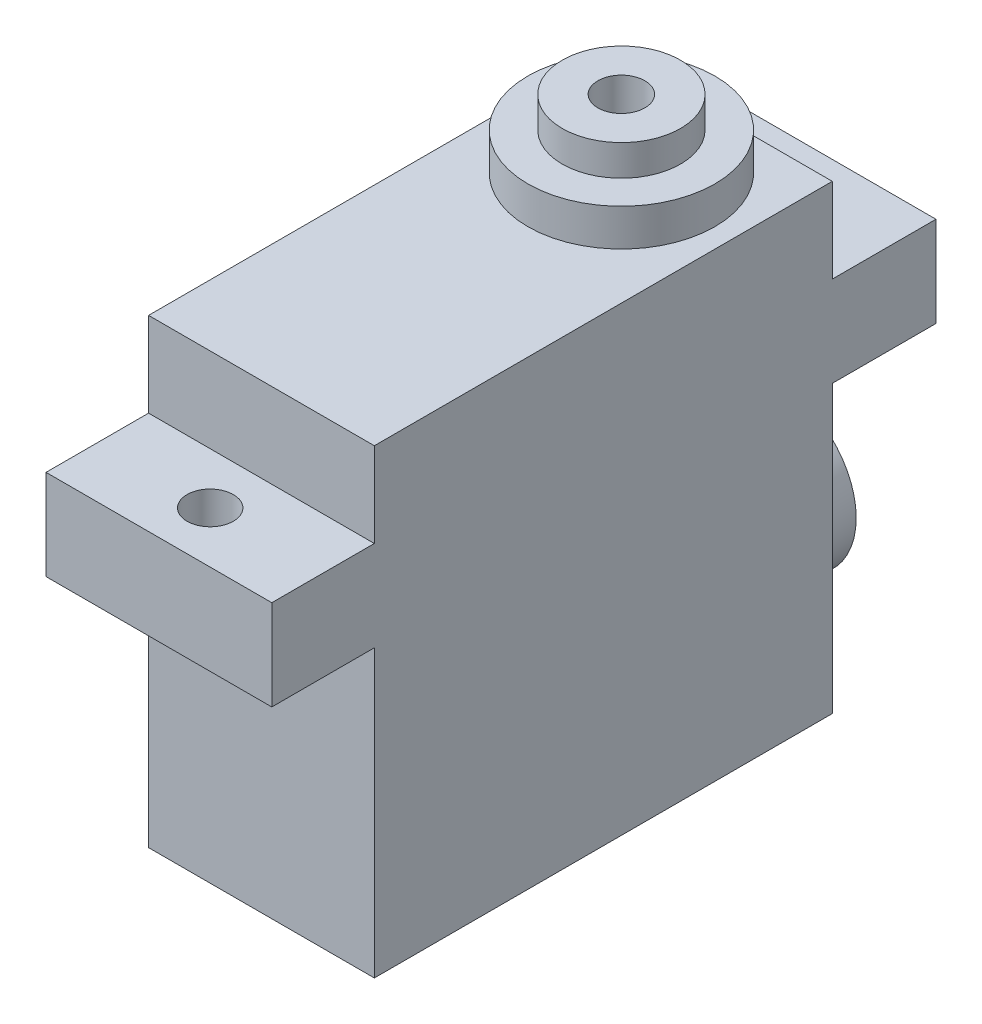
ISO-10303-21;
HEADER;
FILE_DESCRIPTION(('STEP AP214'),'2;1');
FILE_NAME('part.step','',(''),(''),'','','');
FILE_SCHEMA(('AUTOMOTIVE_DESIGN { 1 0 10303 214 1 1 1 1 }'));
ENDSEC;
DATA;
#1=APPLICATION_CONTEXT('core data for automotive mechanical design processes');
#2=APPLICATION_PROTOCOL_DEFINITION('international standard','automotive_design',2000,#1);
#3=PRODUCT_CONTEXT('',#1,'mechanical');
#4=PRODUCT('Part','Part','',(#3));
#5=PRODUCT_RELATED_PRODUCT_CATEGORY('part','',(#4));
#6=PRODUCT_DEFINITION_FORMATION('','',#4);
#7=PRODUCT_DEFINITION_CONTEXT('part definition',#1,'design');
#8=PRODUCT_DEFINITION('design','',#6,#7);
#9=PRODUCT_DEFINITION_SHAPE('','',#8);
#10=(LENGTH_UNIT() NAMED_UNIT(*) SI_UNIT(.MILLI.,.METRE.));
#11=(NAMED_UNIT(*) PLANE_ANGLE_UNIT() SI_UNIT($,.RADIAN.));
#12=(NAMED_UNIT(*) SI_UNIT($,.STERADIAN.) SOLID_ANGLE_UNIT());
#13=UNCERTAINTY_MEASURE_WITH_UNIT(LENGTH_MEASURE(1.E-05),#10,'distance_accuracy_value','');
#14=(GEOMETRIC_REPRESENTATION_CONTEXT(3) GLOBAL_UNCERTAINTY_ASSIGNED_CONTEXT((#13)) GLOBAL_UNIT_ASSIGNED_CONTEXT((#10,
#11,#12)) REPRESENTATION_CONTEXT('',''));
#15=CARTESIAN_POINT('',(0.,0.,0.));
#16=DIRECTION('',(0.,0.,1.));
#17=DIRECTION('',(1.,0.,0.));
#18=AXIS2_PLACEMENT_3D('',#15,#16,#17);
#19=CARTESIAN_POINT('',(0.,31.115,0.));
#20=DIRECTION('',(0.,0.,-1.));
#21=DIRECTION('',(-1.,0.,0.));
#22=AXIS2_PLACEMENT_3D('',#19,#20,#21);
#23=PLANE('',#22);
#24=DIRECTION('',(0.,-1.,0.));
#25=VECTOR('',#24,1.);
#26=CARTESIAN_POINT('',(0.,31.115,0.));
#27=LINE('',#26,#25);
#28=CARTESIAN_POINT('',(0.,31.115,0.));
#29=VERTEX_POINT('',#28);
#30=CARTESIAN_POINT('',(0.,25.4,0.));
#31=VERTEX_POINT('',#30);
#32=EDGE_CURVE('E244',#29,#31,#27,.T.);
#33=ORIENTED_EDGE('',*,*,#32,.T.);
#34=DIRECTION('',(1.,0.,0.));
#35=VECTOR('',#34,1.);
#36=CARTESIAN_POINT('',(0.,25.4,0.));
#37=LINE('',#36,#35);
#38=CARTESIAN_POINT('',(15.2399999999999,25.4,0.));
#39=VERTEX_POINT('',#38);
#40=EDGE_CURVE('E197',#31,#39,#37,.T.);
#41=ORIENTED_EDGE('',*,*,#40,.T.);
#42=DIRECTION('',(0.,-1.,0.));
#43=VECTOR('',#42,1.);
#44=CARTESIAN_POINT('',(15.2399999999999,31.115,0.));
#45=LINE('',#44,#43);
#46=CARTESIAN_POINT('',(15.2399999999999,31.115,0.));
#47=VERTEX_POINT('',#46);
#48=EDGE_CURVE('E240',#47,#39,#45,.T.);
#49=ORIENTED_EDGE('',*,*,#48,.F.);
#50=DIRECTION('',(1.,0.,0.));
#51=VECTOR('',#50,1.);
#52=CARTESIAN_POINT('',(0.,31.115,0.));
#53=LINE('',#52,#51);
#54=EDGE_CURVE('E206',#29,#47,#53,.T.);
#55=ORIENTED_EDGE('',*,*,#54,.F.);
#56=EDGE_LOOP('',(#33,#41,#49,#55));
#57=FACE_BOUND('',#56,.T.);
#58=ADVANCED_FACE('F39',(#57),#23,.F.);
#59=CARTESIAN_POINT('',(0.,31.115,-30.9117999999999));
#60=DIRECTION('',(0.,0.,1.));
#61=DIRECTION('',(1.,0.,0.));
#62=AXIS2_PLACEMENT_3D('',#59,#60,#61);
#63=PLANE('',#62);
#64=DIRECTION('',(0.,-1.,0.));
#65=VECTOR('',#64,1.);
#66=CARTESIAN_POINT('',(15.2399999999999,31.115,-30.9118));
#67=LINE('',#66,#65);
#68=CARTESIAN_POINT('',(15.2399999999999,31.115,-30.9118));
#69=VERTEX_POINT('',#68);
#70=CARTESIAN_POINT('',(15.2399999999999,25.4,-30.9118));
#71=VERTEX_POINT('',#70);
#72=EDGE_CURVE('E235',#69,#71,#67,.T.);
#73=ORIENTED_EDGE('',*,*,#72,.T.);
#74=DIRECTION('',(-1.,0.,0.));
#75=VECTOR('',#74,1.);
#76=CARTESIAN_POINT('',(0.,25.4,-30.9117999999999));
#77=LINE('',#76,#75);
#78=CARTESIAN_POINT('',(0.,25.4,-30.9118));
#79=VERTEX_POINT('',#78);
#80=EDGE_CURVE('E251',#71,#79,#77,.T.);
#81=ORIENTED_EDGE('',*,*,#80,.T.);
#82=DIRECTION('',(0.,-1.,0.));
#83=VECTOR('',#82,1.);
#84=CARTESIAN_POINT('',(0.,31.115,-30.9117999999999));
#85=LINE('',#84,#83);
#86=CARTESIAN_POINT('',(0.,31.115,-30.9117999999999));
#87=VERTEX_POINT('',#86);
#88=EDGE_CURVE('E230',#87,#79,#85,.T.);
#89=ORIENTED_EDGE('',*,*,#88,.F.);
#90=DIRECTION('',(-1.,0.,0.));
#91=VECTOR('',#90,1.);
#92=CARTESIAN_POINT('',(0.,31.115,-30.9117999999999));
#93=LINE('',#92,#91);
#94=EDGE_CURVE('E213',#69,#87,#93,.T.);
#95=ORIENTED_EDGE('',*,*,#94,.F.);
#96=EDGE_LOOP('',(#73,#81,#89,#95));
#97=FACE_BOUND('',#96,.T.);
#98=ADVANCED_FACE('F283',(#97),#63,.F.);
#99=CARTESIAN_POINT('',(0.,31.115,0.));
#100=DIRECTION('',(1.,0.,0.));
#101=DIRECTION('',(0.,0.,-1.));
#102=AXIS2_PLACEMENT_3D('',#99,#100,#101);
#103=PLANE('',#102);
#104=CARTESIAN_POINT('',(0.,19.304,0.));
#105=VERTEX_POINT('',#104);
#106=CARTESIAN_POINT('',(0.,0.,0.));
#107=VERTEX_POINT('',#106);
#108=EDGE_CURVE('E134',#105,#107,#27,.T.);
#109=ORIENTED_EDGE('',*,*,#108,.F.);
#110=DIRECTION('',(0.,0.,1.));
#111=VECTOR('',#110,1.);
#112=CARTESIAN_POINT('',(0.,19.304,-37.9095));
#113=LINE('',#112,#111);
#114=CARTESIAN_POINT('',(0.,19.304,6.9215));
#115=VERTEX_POINT('',#114);
#116=EDGE_CURVE('E56',#105,#115,#113,.T.);
#117=ORIENTED_EDGE('',*,*,#116,.T.);
#118=DIRECTION('',(0.,-1.,0.));
#119=VECTOR('',#118,1.);
#120=CARTESIAN_POINT('',(0.,25.4,6.9215));
#121=LINE('',#120,#119);
#122=CARTESIAN_POINT('',(0.,25.4,6.9215));
#123=VERTEX_POINT('',#122);
#124=EDGE_CURVE('E132',#123,#115,#121,.T.);
#125=ORIENTED_EDGE('',*,*,#124,.F.);
#126=DIRECTION('',(0.,0.,1.));
#127=VECTOR('',#126,1.);
#128=CARTESIAN_POINT('',(0.,25.4,-37.9095));
#129=LINE('',#128,#127);
#130=EDGE_CURVE('E185',#31,#123,#129,.T.);
#131=ORIENTED_EDGE('',*,*,#130,.F.);
#132=ORIENTED_EDGE('',*,*,#32,.F.);
#133=DIRECTION('',(0.,0.,1.));
#134=VECTOR('',#133,1.);
#135=CARTESIAN_POINT('',(0.,31.115,0.));
#136=LINE('',#135,#134);
#137=EDGE_CURVE('E202',#87,#29,#136,.T.);
#138=ORIENTED_EDGE('',*,*,#137,.F.);
#139=ORIENTED_EDGE('',*,*,#88,.T.);
#140=CARTESIAN_POINT('',(0.,25.4,-37.9095));
#141=VERTEX_POINT('',#140);
#142=EDGE_CURVE('E181',#141,#79,#129,.T.);
#143=ORIENTED_EDGE('',*,*,#142,.F.);
#144=DIRECTION('',(0.,-1.,0.));
#145=VECTOR('',#144,1.);
#146=CARTESIAN_POINT('',(0.,25.4,-37.9095));
#147=LINE('',#146,#145);
#148=CARTESIAN_POINT('',(0.,19.304,-37.9095));
#149=VERTEX_POINT('',#148);
#150=EDGE_CURVE('E167',#141,#149,#147,.T.);
#151=ORIENTED_EDGE('',*,*,#150,.T.);
#152=CARTESIAN_POINT('',(0.,19.304,-30.9118));
#153=VERTEX_POINT('',#152);
#154=EDGE_CURVE('E136',#149,#153,#113,.T.);
#155=ORIENTED_EDGE('',*,*,#154,.T.);
#156=CARTESIAN_POINT('',(0.,0.,-30.9117999999999));
#157=VERTEX_POINT('',#156);
#158=EDGE_CURVE('E216',#153,#157,#85,.T.);
#159=ORIENTED_EDGE('',*,*,#158,.T.);
#160=DIRECTION('',(0.,0.,1.));
#161=VECTOR('',#160,1.);
#162=CARTESIAN_POINT('',(0.,0.,0.));
#163=LINE('',#162,#161);
#164=EDGE_CURVE('E201',#157,#107,#163,.T.);
#165=ORIENTED_EDGE('',*,*,#164,.T.);
#166=EDGE_LOOP('',(#109,#117,#125,#131,#132,#138,#139,#143,#151,#155,#159,#165));
#167=FACE_BOUND('',#166,.T.);
#168=ADVANCED_FACE('F41',(#167),#103,.F.);
#169=CARTESIAN_POINT('',(15.2399999999999,19.304,0.));
#170=VERTEX_POINT('',#169);
#171=CARTESIAN_POINT('',(15.2399999999999,0.,0.));
#172=VERTEX_POINT('',#171);
#173=EDGE_CURVE('E239',#170,#172,#45,.T.);
#174=ORIENTED_EDGE('',*,*,#173,.F.);
#175=DIRECTION('',(-1.,0.,0.));
#176=VECTOR('',#175,1.);
#177=CARTESIAN_POINT('',(0.,19.304,0.));
#178=LINE('',#177,#176);
#179=EDGE_CURVE('E184',#170,#105,#178,.T.);
#180=ORIENTED_EDGE('',*,*,#179,.T.);
#181=ORIENTED_EDGE('',*,*,#108,.T.);
#182=DIRECTION('',(1.,0.,0.));
#183=VECTOR('',#182,1.);
#184=CARTESIAN_POINT('',(0.,0.,0.));
#185=LINE('',#184,#183);
#186=EDGE_CURVE('E219',#107,#172,#185,.T.);
#187=ORIENTED_EDGE('',*,*,#186,.T.);
#188=EDGE_LOOP('',(#174,#180,#181,#187));
#189=FACE_BOUND('',#188,.T.);
#190=ADVANCED_FACE('F317',(#189),#23,.F.);
#191=CARTESIAN_POINT('',(15.2399999999999,31.115,0.));
#192=DIRECTION('',(-1.,0.,0.));
#193=DIRECTION('',(0.,0.,1.));
#194=AXIS2_PLACEMENT_3D('',#191,#192,#193);
#195=PLANE('',#194);
#196=CARTESIAN_POINT('',(15.2399999999999,19.304,-30.9118));
#197=VERTEX_POINT('',#196);
#198=CARTESIAN_POINT('',(15.2399999999999,0.,-30.9118));
#199=VERTEX_POINT('',#198);
#200=EDGE_CURVE('E234',#197,#199,#67,.T.);
#201=ORIENTED_EDGE('',*,*,#200,.F.);
#202=DIRECTION('',(0.,0.,1.));
#203=VECTOR('',#202,1.);
#204=CARTESIAN_POINT('',(15.2399999999999,19.304,-37.9095));
#205=LINE('',#204,#203);
#206=CARTESIAN_POINT('',(15.2399999999999,19.304,-37.9095));
#207=VERTEX_POINT('',#206);
#208=EDGE_CURVE('E64',#207,#197,#205,.T.);
#209=ORIENTED_EDGE('',*,*,#208,.F.);
#210=DIRECTION('',(0.,1.,0.));
#211=VECTOR('',#210,1.);
#212=CARTESIAN_POINT('',(15.2399999999999,25.4,-37.9095));
#213=LINE('',#212,#211);
#214=CARTESIAN_POINT('',(15.2399999999999,25.4,-37.9095));
#215=VERTEX_POINT('',#214);
#216=EDGE_CURVE('E174',#207,#215,#213,.T.);
#217=ORIENTED_EDGE('',*,*,#216,.T.);
#218=DIRECTION('',(0.,0.,1.));
#219=VECTOR('',#218,1.);
#220=CARTESIAN_POINT('',(15.2399999999999,25.4,-37.9095));
#221=LINE('',#220,#219);
#222=EDGE_CURVE('E186',#215,#71,#221,.T.);
#223=ORIENTED_EDGE('',*,*,#222,.T.);
#224=ORIENTED_EDGE('',*,*,#72,.F.);
#225=DIRECTION('',(0.,0.,-1.));
#226=VECTOR('',#225,1.);
#227=CARTESIAN_POINT('',(15.2399999999999,31.115,0.));
#228=LINE('',#227,#226);
#229=EDGE_CURVE('E210',#47,#69,#228,.T.);
#230=ORIENTED_EDGE('',*,*,#229,.F.);
#231=ORIENTED_EDGE('',*,*,#48,.T.);
#232=CARTESIAN_POINT('',(15.2399999999999,25.4,6.9215));
#233=VERTEX_POINT('',#232);
#234=EDGE_CURVE('E190',#39,#233,#221,.T.);
#235=ORIENTED_EDGE('',*,*,#234,.T.);
#236=DIRECTION('',(0.,1.,0.));
#237=VECTOR('',#236,1.);
#238=CARTESIAN_POINT('',(15.2399999999999,25.4,6.9215));
#239=LINE('',#238,#237);
#240=CARTESIAN_POINT('',(15.2399999999999,19.304,6.9215));
#241=VERTEX_POINT('',#240);
#242=EDGE_CURVE('E148',#241,#233,#239,.T.);
#243=ORIENTED_EDGE('',*,*,#242,.F.);
#244=EDGE_CURVE('E143',#170,#241,#205,.T.);
#245=ORIENTED_EDGE('',*,*,#244,.F.);
#246=ORIENTED_EDGE('',*,*,#173,.T.);
#247=DIRECTION('',(0.,0.,-1.));
#248=VECTOR('',#247,1.);
#249=CARTESIAN_POINT('',(15.2399999999999,0.,0.));
#250=LINE('',#249,#248);
#251=EDGE_CURVE('E223',#172,#199,#250,.T.);
#252=ORIENTED_EDGE('',*,*,#251,.T.);
#253=EDGE_LOOP('',(#201,#209,#217,#223,#224,#230,#231,#235,#243,#245,#246,#252));
#254=FACE_BOUND('',#253,.T.);
#255=ADVANCED_FACE('F281',(#254),#195,.F.);
#256=CARTESIAN_POINT('',(7.61999999999996,8.2804,-30.9118));
#257=DIRECTION('',(0.,0.,1.));
#258=DIRECTION('',(1.,0.,0.));
#259=AXIS2_PLACEMENT_3D('',#256,#257,#258);
#260=CIRCLE('',#259,5.2705);
#261=CARTESIAN_POINT('',(12.8905,8.2804,-30.9118));
#262=VERTEX_POINT('',#261);
#263=EDGE_CURVE('E254',#262,#262,#260,.F.);
#264=ORIENTED_EDGE('',*,*,#263,.F.);
#265=EDGE_LOOP('',(#264));
#266=FACE_BOUND('',#265,.T.);
#267=ORIENTED_EDGE('',*,*,#158,.F.);
#268=DIRECTION('',(1.,0.,0.));
#269=VECTOR('',#268,1.);
#270=CARTESIAN_POINT('',(0.,19.304,-30.9117999999999));
#271=LINE('',#270,#269);
#272=EDGE_CURVE('E248',#153,#197,#271,.T.);
#273=ORIENTED_EDGE('',*,*,#272,.T.);
#274=ORIENTED_EDGE('',*,*,#200,.T.);
#275=DIRECTION('',(-1.,0.,0.));
#276=VECTOR('',#275,1.);
#277=CARTESIAN_POINT('',(0.,0.,-30.9117999999999));
#278=LINE('',#277,#276);
#279=EDGE_CURVE('E207',#199,#157,#278,.T.);
#280=ORIENTED_EDGE('',*,*,#279,.T.);
#281=EDGE_LOOP('',(#267,#273,#274,#280));
#282=FACE_BOUND('',#281,.T.);
#283=ADVANCED_FACE('F269',(#266,#282),#63,.F.);
#284=CARTESIAN_POINT('',(0.,31.115,0.));
#285=DIRECTION('',(0.,-1.,0.));
#286=DIRECTION('',(0.,0.,-1.));
#287=AXIS2_PLACEMENT_3D('',#284,#285,#286);
#288=PLANE('',#287);
#289=CARTESIAN_POINT('',(7.61999999999996,31.115,-24.2951));
#290=DIRECTION('',(0.,-1.,0.));
#291=DIRECTION('',(0.,0.,-1.));
#292=AXIS2_PLACEMENT_3D('',#289,#290,#291);
#293=CIRCLE('',#292,6.3119);
#294=CARTESIAN_POINT('',(7.61999999999996,31.115,-30.607));
#295=VERTEX_POINT('',#294);
#296=EDGE_CURVE('E43',#295,#295,#293,.F.);
#297=ORIENTED_EDGE('',*,*,#296,.F.);
#298=EDGE_LOOP('',(#297));
#299=FACE_BOUND('',#298,.T.);
#300=ORIENTED_EDGE('',*,*,#137,.T.);
#301=ORIENTED_EDGE('',*,*,#54,.T.);
#302=ORIENTED_EDGE('',*,*,#229,.T.);
#303=ORIENTED_EDGE('',*,*,#94,.T.);
#304=EDGE_LOOP('',(#300,#301,#302,#303));
#305=FACE_BOUND('',#304,.T.);
#306=ADVANCED_FACE('F265',(#299,#305),#288,.F.);
#307=CARTESIAN_POINT('',(0.,0.,0.));
#308=DIRECTION('',(0.,-1.,0.));
#309=DIRECTION('',(0.,0.,-1.));
#310=AXIS2_PLACEMENT_3D('',#307,#308,#309);
#311=PLANE('',#310);
#312=ORIENTED_EDGE('',*,*,#164,.F.);
#313=ORIENTED_EDGE('',*,*,#279,.F.);
#314=ORIENTED_EDGE('',*,*,#251,.F.);
#315=ORIENTED_EDGE('',*,*,#186,.F.);
#316=EDGE_LOOP('',(#312,#313,#314,#315));
#317=FACE_BOUND('',#316,.T.);
#318=ADVANCED_FACE('F268',(#317),#311,.T.);
#319=CARTESIAN_POINT('',(0.,0.,-37.9095));
#320=DIRECTION('',(0.,0.,1.));
#321=DIRECTION('',(1.,0.,0.));
#322=AXIS2_PLACEMENT_3D('',#319,#320,#321);
#323=PLANE('',#322);
#324=ORIENTED_EDGE('',*,*,#150,.F.);
#325=DIRECTION('',(-1.,0.,0.));
#326=VECTOR('',#325,1.);
#327=CARTESIAN_POINT('',(0.,25.4,-37.9095));
#328=LINE('',#327,#326);
#329=EDGE_CURVE('E137',#215,#141,#328,.T.);
#330=ORIENTED_EDGE('',*,*,#329,.F.);
#331=ORIENTED_EDGE('',*,*,#216,.F.);
#332=DIRECTION('',(1.,0.,0.));
#333=VECTOR('',#332,1.);
#334=CARTESIAN_POINT('',(0.,19.304,-37.9095));
#335=LINE('',#334,#333);
#336=EDGE_CURVE('E171',#149,#207,#335,.T.);
#337=ORIENTED_EDGE('',*,*,#336,.F.);
#338=EDGE_LOOP('',(#324,#330,#331,#337));
#339=FACE_BOUND('',#338,.T.);
#340=ADVANCED_FACE('F289',(#339),#323,.F.);
#341=CARTESIAN_POINT('',(0.,19.304,-37.9095));
#342=DIRECTION('',(0.,-1.,0.));
#343=DIRECTION('',(0.,0.,-1.));
#344=AXIS2_PLACEMENT_3D('',#341,#342,#343);
#345=PLANE('',#344);
#346=CARTESIAN_POINT('',(7.61999999999996,19.304,-34.41065));
#347=DIRECTION('',(0.,-1.,0.));
#348=DIRECTION('',(0.,0.,-1.));
#349=AXIS2_PLACEMENT_3D('',#346,#347,#348);
#350=CIRCLE('',#349,1.5621);
#351=CARTESIAN_POINT('',(7.61999999999996,19.304,-32.84855));
#352=VERTEX_POINT('',#351);
#353=EDGE_CURVE('E538',#352,#352,#350,.F.);
#354=ORIENTED_EDGE('',*,*,#353,.T.);
#355=EDGE_LOOP('',(#354));
#356=FACE_BOUND('',#355,.T.);
#357=ORIENTED_EDGE('',*,*,#272,.F.);
#358=ORIENTED_EDGE('',*,*,#154,.F.);
#359=ORIENTED_EDGE('',*,*,#336,.T.);
#360=ORIENTED_EDGE('',*,*,#208,.T.);
#361=EDGE_LOOP('',(#357,#358,#359,#360));
#362=FACE_BOUND('',#361,.T.);
#363=ADVANCED_FACE('F292',(#356,#362),#345,.T.);
#364=CARTESIAN_POINT('',(0.,25.4,-37.9095));
#365=DIRECTION('',(0.,1.,0.));
#366=DIRECTION('',(0.,0.,1.));
#367=AXIS2_PLACEMENT_3D('',#364,#365,#366);
#368=PLANE('',#367);
#369=CARTESIAN_POINT('',(7.61999999999996,25.4,-34.41065));
#370=DIRECTION('',(0.,1.,0.));
#371=DIRECTION('',(0.,0.,1.));
#372=AXIS2_PLACEMENT_3D('',#369,#370,#371);
#373=CIRCLE('',#372,1.5621);
#374=CARTESIAN_POINT('',(7.61999999999996,25.4,-32.84855));
#375=VERTEX_POINT('',#374);
#376=EDGE_CURVE('E546',#375,#375,#373,.T.);
#377=ORIENTED_EDGE('',*,*,#376,.F.);
#378=EDGE_LOOP('',(#377));
#379=FACE_BOUND('',#378,.T.);
#380=ORIENTED_EDGE('',*,*,#80,.F.);
#381=ORIENTED_EDGE('',*,*,#222,.F.);
#382=ORIENTED_EDGE('',*,*,#329,.T.);
#383=ORIENTED_EDGE('',*,*,#142,.T.);
#384=EDGE_LOOP('',(#380,#381,#382,#383));
#385=FACE_BOUND('',#384,.T.);
#386=ADVANCED_FACE('F291',(#379,#385),#368,.T.);
#387=CARTESIAN_POINT('',(7.61999999999996,25.4,3.46075));
#388=DIRECTION('',(0.,1.,0.));
#389=DIRECTION('',(0.,0.,1.));
#390=AXIS2_PLACEMENT_3D('',#387,#388,#389);
#391=CIRCLE('',#390,1.5621);
#392=CARTESIAN_POINT('',(7.61999999999996,25.4,5.02285));
#393=VERTEX_POINT('',#392);
#394=EDGE_CURVE('E551',#393,#393,#391,.T.);
#395=ORIENTED_EDGE('',*,*,#394,.F.);
#396=EDGE_LOOP('',(#395));
#397=FACE_BOUND('',#396,.T.);
#398=ORIENTED_EDGE('',*,*,#40,.F.);
#399=ORIENTED_EDGE('',*,*,#130,.T.);
#400=DIRECTION('',(-1.,0.,0.));
#401=VECTOR('',#400,1.);
#402=CARTESIAN_POINT('',(0.,25.4,6.9215));
#403=LINE('',#402,#401);
#404=EDGE_CURVE('E153',#233,#123,#403,.T.);
#405=ORIENTED_EDGE('',*,*,#404,.F.);
#406=ORIENTED_EDGE('',*,*,#234,.F.);
#407=EDGE_LOOP('',(#398,#399,#405,#406));
#408=FACE_BOUND('',#407,.T.);
#409=ADVANCED_FACE('F303',(#397,#408),#368,.T.);
#410=CARTESIAN_POINT('',(7.61999999999996,19.304,3.46075));
#411=DIRECTION('',(0.,-1.,0.));
#412=DIRECTION('',(0.,0.,-1.));
#413=AXIS2_PLACEMENT_3D('',#410,#411,#412);
#414=CIRCLE('',#413,1.5621);
#415=CARTESIAN_POINT('',(7.61999999999996,19.304,5.02285));
#416=VERTEX_POINT('',#415);
#417=EDGE_CURVE('E550',#416,#416,#414,.F.);
#418=ORIENTED_EDGE('',*,*,#417,.T.);
#419=EDGE_LOOP('',(#418));
#420=FACE_BOUND('',#419,.T.);
#421=ORIENTED_EDGE('',*,*,#179,.F.);
#422=ORIENTED_EDGE('',*,*,#244,.T.);
#423=DIRECTION('',(1.,0.,0.));
#424=VECTOR('',#423,1.);
#425=CARTESIAN_POINT('',(0.,19.304,6.9215));
#426=LINE('',#425,#424);
#427=EDGE_CURVE('E140',#115,#241,#426,.T.);
#428=ORIENTED_EDGE('',*,*,#427,.F.);
#429=ORIENTED_EDGE('',*,*,#116,.F.);
#430=EDGE_LOOP('',(#421,#422,#428,#429));
#431=FACE_BOUND('',#430,.T.);
#432=ADVANCED_FACE('F141',(#420,#431),#345,.T.);
#433=CARTESIAN_POINT('',(0.,0.,6.9215));
#434=DIRECTION('',(0.,0.,1.));
#435=DIRECTION('',(1.,0.,0.));
#436=AXIS2_PLACEMENT_3D('',#433,#434,#435);
#437=PLANE('',#436);
#438=ORIENTED_EDGE('',*,*,#124,.T.);
#439=ORIENTED_EDGE('',*,*,#427,.T.);
#440=ORIENTED_EDGE('',*,*,#242,.T.);
#441=ORIENTED_EDGE('',*,*,#404,.T.);
#442=EDGE_LOOP('',(#438,#439,#440,#441));
#443=FACE_BOUND('',#442,.T.);
#444=ADVANCED_FACE('F151',(#443),#437,.T.);
#445=CARTESIAN_POINT('',(7.61999999999994,8.2804,-34.8742));
#446=DIRECTION('',(0.,0.,1.));
#447=DIRECTION('',(1.,0.,0.));
#448=AXIS2_PLACEMENT_3D('',#445,#446,#447);
#449=CYLINDRICAL_SURFACE('',#448,5.2705);
#450=CARTESIAN_POINT('',(7.61999999999994,8.2804,-34.8742));
#451=DIRECTION('',(0.,0.,-1.));
#452=DIRECTION('',(-1.,0.,0.));
#453=AXIS2_PLACEMENT_3D('',#450,#451,#452);
#454=CIRCLE('',#453,5.2705);
#455=CARTESIAN_POINT('',(2.34949999999994,8.2804,-34.8741999999999));
#456=VERTEX_POINT('',#455);
#457=EDGE_CURVE('E155',#456,#456,#454,.T.);
#458=ORIENTED_EDGE('',*,*,#457,.F.);
#459=EDGE_LOOP('',(#458));
#460=FACE_BOUND('',#459,.T.);
#461=ORIENTED_EDGE('',*,*,#263,.T.);
#462=EDGE_LOOP('',(#461));
#463=FACE_BOUND('',#462,.T.);
#464=ADVANCED_FACE('F471',(#460,#463),#449,.T.);
#465=CARTESIAN_POINT('',(7.61999999999994,8.2804,-34.8742));
#466=DIRECTION('',(0.,0.,-1.));
#467=DIRECTION('',(-1.,0.,0.));
#468=AXIS2_PLACEMENT_3D('',#465,#466,#467);
#469=PLANE('',#468);
#470=ORIENTED_EDGE('',*,*,#457,.T.);
#471=EDGE_LOOP('',(#470));
#472=FACE_BOUND('',#471,.T.);
#473=ADVANCED_FACE('F359',(#472),#469,.T.);
#474=CARTESIAN_POINT('',(7.61999999999996,33.6169,-24.2951));
#475=DIRECTION('',(0.,-1.,0.));
#476=DIRECTION('',(0.,0.,-1.));
#477=AXIS2_PLACEMENT_3D('',#474,#475,#476);
#478=CYLINDRICAL_SURFACE('',#477,6.3119);
#479=CARTESIAN_POINT('',(7.61999999999996,33.6169,-24.2951));
#480=DIRECTION('',(0.,1.,0.));
#481=DIRECTION('',(0.,0.,1.));
#482=AXIS2_PLACEMENT_3D('',#479,#480,#481);
#483=CIRCLE('',#482,6.3119);
#484=CARTESIAN_POINT('',(7.61999999999996,33.6169,-17.9832));
#485=VERTEX_POINT('',#484);
#486=EDGE_CURVE('E159',#485,#485,#483,.T.);
#487=ORIENTED_EDGE('',*,*,#486,.F.);
#488=EDGE_LOOP('',(#487));
#489=FACE_BOUND('',#488,.T.);
#490=ORIENTED_EDGE('',*,*,#296,.T.);
#491=EDGE_LOOP('',(#490));
#492=FACE_BOUND('',#491,.T.);
#493=ADVANCED_FACE('F263',(#489,#492),#478,.T.);
#494=CARTESIAN_POINT('',(7.61999999999996,33.6169,-24.2951));
#495=DIRECTION('',(0.,1.,0.));
#496=DIRECTION('',(0.,0.,1.));
#497=AXIS2_PLACEMENT_3D('',#494,#495,#496);
#498=PLANE('',#497);
#499=CARTESIAN_POINT('',(7.61999999999996,33.6169,-24.2951));
#500=DIRECTION('',(0.,1.,0.));
#501=DIRECTION('',(0.,0.,1.));
#502=AXIS2_PLACEMENT_3D('',#499,#500,#501);
#503=CIRCLE('',#502,3.99415);
#504=CARTESIAN_POINT('',(7.61999999999996,33.6169,-20.30095));
#505=VERTEX_POINT('',#504);
#506=EDGE_CURVE('E11',#505,#505,#503,.T.);
#507=ORIENTED_EDGE('',*,*,#506,.F.);
#508=EDGE_LOOP('',(#507));
#509=FACE_BOUND('',#508,.T.);
#510=ORIENTED_EDGE('',*,*,#486,.T.);
#511=EDGE_LOOP('',(#510));
#512=FACE_BOUND('',#511,.T.);
#513=ADVANCED_FACE('F366',(#509,#512),#498,.T.);
#514=CARTESIAN_POINT('',(7.61999999999996,-0.001000000000001,3.46075));
#515=DIRECTION('',(0.,1.,0.));
#516=DIRECTION('',(0.,0.,1.));
#517=AXIS2_PLACEMENT_3D('',#514,#515,#516);
#518=CYLINDRICAL_SURFACE('',#517,1.5621);
#519=CARTESIAN_POINT('',(7.61999999999996,19.304,5.02285));
#520=CARTESIAN_POINT('',(7.61999999999996,19.3675,5.02285));
#521=CARTESIAN_POINT('',(7.61999999999996,19.431,5.02285));
#522=CARTESIAN_POINT('',(7.61999999999996,19.558,5.02285));
#523=CARTESIAN_POINT('',(7.61999999999996,19.6215,5.02285));
#524=CARTESIAN_POINT('',(7.61999999999996,19.7485,5.02285));
#525=CARTESIAN_POINT('',(7.61999999999996,19.812,5.02285));
#526=CARTESIAN_POINT('',(7.61999999999996,19.939,5.02285));
#527=CARTESIAN_POINT('',(7.61999999999996,20.0025,5.02285));
#528=CARTESIAN_POINT('',(7.61999999999996,20.1295,5.02285));
#529=CARTESIAN_POINT('',(7.61999999999996,20.193,5.02285));
#530=CARTESIAN_POINT('',(7.61999999999996,20.32,5.02285));
#531=CARTESIAN_POINT('',(7.61999999999996,20.3835,5.02285));
#532=CARTESIAN_POINT('',(7.61999999999996,20.5105,5.02285));
#533=CARTESIAN_POINT('',(7.61999999999996,20.574,5.02285));
#534=CARTESIAN_POINT('',(7.61999999999996,20.701,5.02285));
#535=CARTESIAN_POINT('',(7.61999999999996,20.7645,5.02285));
#536=CARTESIAN_POINT('',(7.61999999999996,20.8915,5.02285));
#537=CARTESIAN_POINT('',(7.61999999999996,20.955,5.02285));
#538=CARTESIAN_POINT('',(7.61999999999996,21.082,5.02285));
#539=CARTESIAN_POINT('',(7.61999999999996,21.1455,5.02285));
#540=CARTESIAN_POINT('',(7.61999999999996,21.2725,5.02285));
#541=CARTESIAN_POINT('',(7.61999999999996,21.336,5.02285));
#542=CARTESIAN_POINT('',(7.61999999999996,21.463,5.02285));
#543=CARTESIAN_POINT('',(7.61999999999996,21.5265,5.02285));
#544=CARTESIAN_POINT('',(7.61999999999996,21.6535,5.02285));
#545=CARTESIAN_POINT('',(7.61999999999996,21.717,5.02285));
#546=CARTESIAN_POINT('',(7.61999999999996,21.844,5.02285));
#547=CARTESIAN_POINT('',(7.61999999999996,21.9075,5.02285));
#548=CARTESIAN_POINT('',(7.61999999999996,22.0345,5.02285));
#549=CARTESIAN_POINT('',(7.61999999999996,22.098,5.02285));
#550=CARTESIAN_POINT('',(7.61999999999996,22.225,5.02285));
#551=CARTESIAN_POINT('',(7.61999999999996,22.2885,5.02285));
#552=CARTESIAN_POINT('',(7.61999999999996,22.4155,5.02285));
#553=CARTESIAN_POINT('',(7.61999999999996,22.479,5.02285));
#554=CARTESIAN_POINT('',(7.61999999999996,22.606,5.02285));
#555=CARTESIAN_POINT('',(7.61999999999996,22.6695,5.02285));
#556=CARTESIAN_POINT('',(7.61999999999996,22.7965,5.02285));
#557=CARTESIAN_POINT('',(7.61999999999996,22.86,5.02285));
#558=CARTESIAN_POINT('',(7.61999999999996,22.987,5.02285));
#559=CARTESIAN_POINT('',(7.61999999999996,23.0505,5.02285));
#560=CARTESIAN_POINT('',(7.61999999999996,23.1775,5.02285));
#561=CARTESIAN_POINT('',(7.61999999999996,23.241,5.02285));
#562=CARTESIAN_POINT('',(7.61999999999996,23.368,5.02285));
#563=CARTESIAN_POINT('',(7.61999999999996,23.4315,5.02285));
#564=CARTESIAN_POINT('',(7.61999999999996,23.5585,5.02285));
#565=CARTESIAN_POINT('',(7.61999999999996,23.622,5.02285));
#566=CARTESIAN_POINT('',(7.61999999999996,23.749,5.02285));
#567=CARTESIAN_POINT('',(7.61999999999996,23.8125,5.02285));
#568=CARTESIAN_POINT('',(7.61999999999996,23.9395,5.02285));
#569=CARTESIAN_POINT('',(7.61999999999996,24.003,5.02285));
#570=CARTESIAN_POINT('',(7.61999999999996,24.13,5.02285));
#571=CARTESIAN_POINT('',(7.61999999999996,24.1935,5.02285));
#572=CARTESIAN_POINT('',(7.61999999999996,24.3205,5.02285));
#573=CARTESIAN_POINT('',(7.61999999999996,24.384,5.02285));
#574=CARTESIAN_POINT('',(7.61999999999996,24.511,5.02285));
#575=CARTESIAN_POINT('',(7.61999999999996,24.5745,5.02285));
#576=CARTESIAN_POINT('',(7.61999999999996,24.7015,5.02285));
#577=CARTESIAN_POINT('',(7.61999999999996,24.765,5.02285));
#578=CARTESIAN_POINT('',(7.61999999999996,24.892,5.02285));
#579=CARTESIAN_POINT('',(7.61999999999996,24.9555,5.02285));
#580=CARTESIAN_POINT('',(7.61999999999996,25.0825,5.02285));
#581=CARTESIAN_POINT('',(7.61999999999996,25.146,5.02285));
#582=CARTESIAN_POINT('',(7.61999999999996,25.273,5.02285));
#583=CARTESIAN_POINT('',(7.61999999999996,25.3365,5.02285));
#584=CARTESIAN_POINT('',(7.61999999999996,25.4,5.02285));
#585=B_SPLINE_CURVE_WITH_KNOTS('',3,(#519,#520,#521,#522,#523,#524,#525,#526,#527,#528,#529,
#530,#531,#532,#533,#534,#535,#536,#537,#538,#539,#540,#541,#542,#543,#544,#545,#546,#547,#548,
#549,#550,#551,#552,#553,#554,#555,#556,#557,#558,#559,#560,#561,#562,#563,#564,#565,#566,#567,
#568,#569,#570,#571,#572,#573,#574,#575,#576,#577,#578,#579,#580,#581,#582,#583,#584),
.UNSPECIFIED.,.F.,.F.,(4,2,2,2,2,2,2,2,2,2,2,2,2,2,2,2,2,2,2,2,2,2,2,2,2,2,2,2,2,2,2,2,4),(0.,
0.1905,0.380999999999999,0.571499999999999,0.761999999999999,0.952499999999998,1.143,1.3335,
1.524,1.7145,1.905,2.0955,2.286,2.4765,2.667,2.8575,3.048,3.2385,3.429,3.6195,3.81,4.0005,4.191,
4.3815,4.572,4.7625,4.953,5.1435,5.334,5.5245,5.715,5.9055,6.096),.UNSPECIFIED.);
#586=EDGE_CURVE('BSEAM388',#416,#393,#585,.T.);
#587=ORIENTED_EDGE('',*,*,#417,.F.);
#588=ORIENTED_EDGE('',*,*,#394,.T.);
#589=ORIENTED_EDGE('',*,*,#586,.T.);
#590=ORIENTED_EDGE('',*,*,#586,.F.);
#591=EDGE_LOOP('',(#587,#589,#588,#590));
#592=FACE_BOUND('',#591,.T.);
#593=ADVANCED_FACE('F388',(#592),#518,.F.);
#594=CARTESIAN_POINT('',(7.61999999999996,-0.001000000000001,-34.41065));
#595=DIRECTION('',(0.,1.,0.));
#596=DIRECTION('',(0.,0.,1.));
#597=AXIS2_PLACEMENT_3D('',#594,#595,#596);
#598=CYLINDRICAL_SURFACE('',#597,1.5621);
#599=CARTESIAN_POINT('',(7.61999999999996,19.304,-32.84855));
#600=CARTESIAN_POINT('',(7.61999999999996,19.3675,-32.84855));
#601=CARTESIAN_POINT('',(7.61999999999996,19.431,-32.84855));
#602=CARTESIAN_POINT('',(7.61999999999996,19.558,-32.84855));
#603=CARTESIAN_POINT('',(7.61999999999996,19.6215,-32.84855));
#604=CARTESIAN_POINT('',(7.61999999999996,19.7485,-32.84855));
#605=CARTESIAN_POINT('',(7.61999999999996,19.812,-32.84855));
#606=CARTESIAN_POINT('',(7.61999999999996,19.939,-32.84855));
#607=CARTESIAN_POINT('',(7.61999999999996,20.0025,-32.84855));
#608=CARTESIAN_POINT('',(7.61999999999996,20.1295,-32.84855));
#609=CARTESIAN_POINT('',(7.61999999999996,20.193,-32.84855));
#610=CARTESIAN_POINT('',(7.61999999999996,20.32,-32.84855));
#611=CARTESIAN_POINT('',(7.61999999999996,20.3835,-32.84855));
#612=CARTESIAN_POINT('',(7.61999999999996,20.5105,-32.84855));
#613=CARTESIAN_POINT('',(7.61999999999996,20.574,-32.84855));
#614=CARTESIAN_POINT('',(7.61999999999996,20.701,-32.84855));
#615=CARTESIAN_POINT('',(7.61999999999996,20.7645,-32.84855));
#616=CARTESIAN_POINT('',(7.61999999999996,20.8915,-32.84855));
#617=CARTESIAN_POINT('',(7.61999999999996,20.955,-32.84855));
#618=CARTESIAN_POINT('',(7.61999999999996,21.082,-32.84855));
#619=CARTESIAN_POINT('',(7.61999999999996,21.1455,-32.84855));
#620=CARTESIAN_POINT('',(7.61999999999996,21.2725,-32.84855));
#621=CARTESIAN_POINT('',(7.61999999999996,21.336,-32.84855));
#622=CARTESIAN_POINT('',(7.61999999999996,21.463,-32.84855));
#623=CARTESIAN_POINT('',(7.61999999999996,21.5265,-32.84855));
#624=CARTESIAN_POINT('',(7.61999999999996,21.6535,-32.84855));
#625=CARTESIAN_POINT('',(7.61999999999996,21.717,-32.84855));
#626=CARTESIAN_POINT('',(7.61999999999996,21.844,-32.84855));
#627=CARTESIAN_POINT('',(7.61999999999996,21.9075,-32.84855));
#628=CARTESIAN_POINT('',(7.61999999999996,22.0345,-32.84855));
#629=CARTESIAN_POINT('',(7.61999999999996,22.098,-32.84855));
#630=CARTESIAN_POINT('',(7.61999999999996,22.225,-32.84855));
#631=CARTESIAN_POINT('',(7.61999999999996,22.2885,-32.84855));
#632=CARTESIAN_POINT('',(7.61999999999996,22.4155,-32.84855));
#633=CARTESIAN_POINT('',(7.61999999999996,22.479,-32.84855));
#634=CARTESIAN_POINT('',(7.61999999999996,22.606,-32.84855));
#635=CARTESIAN_POINT('',(7.61999999999996,22.6695,-32.84855));
#636=CARTESIAN_POINT('',(7.61999999999996,22.7965,-32.84855));
#637=CARTESIAN_POINT('',(7.61999999999996,22.86,-32.84855));
#638=CARTESIAN_POINT('',(7.61999999999996,22.987,-32.84855));
#639=CARTESIAN_POINT('',(7.61999999999996,23.0505,-32.84855));
#640=CARTESIAN_POINT('',(7.61999999999996,23.1775,-32.84855));
#641=CARTESIAN_POINT('',(7.61999999999996,23.241,-32.84855));
#642=CARTESIAN_POINT('',(7.61999999999996,23.368,-32.84855));
#643=CARTESIAN_POINT('',(7.61999999999996,23.4315,-32.84855));
#644=CARTESIAN_POINT('',(7.61999999999996,23.5585,-32.84855));
#645=CARTESIAN_POINT('',(7.61999999999996,23.622,-32.84855));
#646=CARTESIAN_POINT('',(7.61999999999996,23.749,-32.84855));
#647=CARTESIAN_POINT('',(7.61999999999996,23.8125,-32.84855));
#648=CARTESIAN_POINT('',(7.61999999999996,23.9395,-32.84855));
#649=CARTESIAN_POINT('',(7.61999999999996,24.003,-32.84855));
#650=CARTESIAN_POINT('',(7.61999999999996,24.13,-32.84855));
#651=CARTESIAN_POINT('',(7.61999999999996,24.1935,-32.84855));
#652=CARTESIAN_POINT('',(7.61999999999996,24.3205,-32.84855));
#653=CARTESIAN_POINT('',(7.61999999999996,24.384,-32.84855));
#654=CARTESIAN_POINT('',(7.61999999999996,24.511,-32.84855));
#655=CARTESIAN_POINT('',(7.61999999999996,24.5745,-32.84855));
#656=CARTESIAN_POINT('',(7.61999999999996,24.7015,-32.84855));
#657=CARTESIAN_POINT('',(7.61999999999996,24.765,-32.84855));
#658=CARTESIAN_POINT('',(7.61999999999996,24.892,-32.84855));
#659=CARTESIAN_POINT('',(7.61999999999996,24.9555,-32.84855));
#660=CARTESIAN_POINT('',(7.61999999999996,25.0825,-32.84855));
#661=CARTESIAN_POINT('',(7.61999999999996,25.146,-32.84855));
#662=CARTESIAN_POINT('',(7.61999999999996,25.273,-32.84855));
#663=CARTESIAN_POINT('',(7.61999999999996,25.3365,-32.84855));
#664=CARTESIAN_POINT('',(7.61999999999996,25.4,-32.84855));
#665=B_SPLINE_CURVE_WITH_KNOTS('',3,(#599,#600,#601,#602,#603,#604,#605,#606,#607,#608,#609,
#610,#611,#612,#613,#614,#615,#616,#617,#618,#619,#620,#621,#622,#623,#624,#625,#626,#627,#628,
#629,#630,#631,#632,#633,#634,#635,#636,#637,#638,#639,#640,#641,#642,#643,#644,#645,#646,#647,
#648,#649,#650,#651,#652,#653,#654,#655,#656,#657,#658,#659,#660,#661,#662,#663,#664),
.UNSPECIFIED.,.F.,.F.,(4,2,2,2,2,2,2,2,2,2,2,2,2,2,2,2,2,2,2,2,2,2,2,2,2,2,2,2,2,2,2,2,4),(0.,
0.1905,0.380999999999999,0.571499999999999,0.761999999999999,0.952499999999998,1.143,1.3335,
1.524,1.7145,1.905,2.0955,2.286,2.4765,2.667,2.8575,3.048,3.2385,3.429,3.6195,3.81,4.0005,4.191,
4.3815,4.572,4.7625,4.953,5.1435,5.334,5.5245,5.715,5.9055,6.096),.UNSPECIFIED.);
#666=EDGE_CURVE('BSEAM393',#352,#375,#665,.T.);
#667=ORIENTED_EDGE('',*,*,#353,.F.);
#668=ORIENTED_EDGE('',*,*,#376,.T.);
#669=ORIENTED_EDGE('',*,*,#666,.T.);
#670=ORIENTED_EDGE('',*,*,#666,.F.);
#671=EDGE_LOOP('',(#667,#669,#668,#670));
#672=FACE_BOUND('',#671,.T.);
#673=ADVANCED_FACE('F393',(#672),#598,.F.);
#674=CARTESIAN_POINT('',(7.61999999999996,35.6997,-24.2951));
#675=DIRECTION('',(0.,-1.,0.));
#676=DIRECTION('',(0.,0.,-1.));
#677=AXIS2_PLACEMENT_3D('',#674,#675,#676);
#678=CYLINDRICAL_SURFACE('',#677,3.99415);
#679=CARTESIAN_POINT('',(7.61999999999996,35.6997,-24.2951));
#680=DIRECTION('',(0.,1.,0.));
#681=DIRECTION('',(0.,0.,1.));
#682=AXIS2_PLACEMENT_3D('',#679,#680,#681);
#683=CIRCLE('',#682,3.99415);
#684=CARTESIAN_POINT('',(7.61999999999996,35.6997,-20.30095));
#685=VERTEX_POINT('',#684);
#686=EDGE_CURVE('E532',#685,#685,#683,.T.);
#687=ORIENTED_EDGE('',*,*,#686,.F.);
#688=EDGE_LOOP('',(#687));
#689=FACE_BOUND('',#688,.T.);
#690=ORIENTED_EDGE('',*,*,#506,.T.);
#691=EDGE_LOOP('',(#690));
#692=FACE_BOUND('',#691,.T.);
#693=ADVANCED_FACE('F417',(#689,#692),#678,.T.);
#694=CARTESIAN_POINT('',(7.61999999999996,35.6997,-24.2951));
#695=DIRECTION('',(0.,1.,0.));
#696=DIRECTION('',(0.,0.,1.));
#697=AXIS2_PLACEMENT_3D('',#694,#695,#696);
#698=PLANE('',#697);
#699=CARTESIAN_POINT('',(7.61999999999996,35.6997,-24.2951));
#700=DIRECTION('',(0.,1.,0.));
#701=DIRECTION('',(0.,0.,1.));
#702=AXIS2_PLACEMENT_3D('',#699,#700,#701);
#703=CIRCLE('',#702,1.5875);
#704=CARTESIAN_POINT('',(7.61999999999996,35.6997,-22.7076));
#705=VERTEX_POINT('',#704);
#706=EDGE_CURVE('E533',#705,#705,#703,.T.);
#707=ORIENTED_EDGE('',*,*,#706,.F.);
#708=EDGE_LOOP('',(#707));
#709=FACE_BOUND('',#708,.T.);
#710=ORIENTED_EDGE('',*,*,#686,.T.);
#711=EDGE_LOOP('',(#710));
#712=FACE_BOUND('',#711,.T.);
#713=ADVANCED_FACE('F434',(#709,#712),#698,.T.);
#714=CARTESIAN_POINT('',(7.61999999999996,33.1597,-24.2951));
#715=DIRECTION('',(0.,1.,0.));
#716=DIRECTION('',(0.,0.,1.));
#717=AXIS2_PLACEMENT_3D('',#714,#715,#716);
#718=CYLINDRICAL_SURFACE('',#717,1.5875);
#719=CARTESIAN_POINT('',(7.61999999999996,33.1597,-24.2951));
#720=DIRECTION('',(0.,1.,0.));
#721=DIRECTION('',(0.,0.,1.));
#722=AXIS2_PLACEMENT_3D('',#719,#720,#721);
#723=CIRCLE('',#722,1.5875);
#724=CARTESIAN_POINT('',(7.61999999999996,33.1597,-22.7076));
#725=VERTEX_POINT('',#724);
#726=EDGE_CURVE('E530',#725,#725,#723,.T.);
#727=ORIENTED_EDGE('',*,*,#726,.F.);
#728=EDGE_LOOP('',(#727));
#729=FACE_BOUND('',#728,.T.);
#730=ORIENTED_EDGE('',*,*,#706,.T.);
#731=EDGE_LOOP('',(#730));
#732=FACE_BOUND('',#731,.T.);
#733=ADVANCED_FACE('F444',(#729,#732),#718,.F.);
#734=CARTESIAN_POINT('',(7.61999999999996,33.1597,-24.2951));
#735=DIRECTION('',(0.,1.,0.));
#736=DIRECTION('',(0.,0.,1.));
#737=AXIS2_PLACEMENT_3D('',#734,#735,#736);
#738=PLANE('',#737);
#739=ORIENTED_EDGE('',*,*,#726,.T.);
#740=EDGE_LOOP('',(#739));
#741=FACE_BOUND('',#740,.T.);
#742=ADVANCED_FACE('F454',(#741),#738,.T.);
#743=CLOSED_SHELL('',(#58,#98,#168,#190,#255,#283,#306,#318,#340,#363,#386,#409,#432,#444,#464,
#473,#493,#513,#593,#673,#693,#713,#733,#742));
#744=MANIFOLD_SOLID_BREP('B2',#743);
#745=ADVANCED_BREP_SHAPE_REPRESENTATION('',(#18,#744),#14);
#746=SHAPE_DEFINITION_REPRESENTATION(#9,#745);
ENDSEC;
END-ISO-10303-21;
